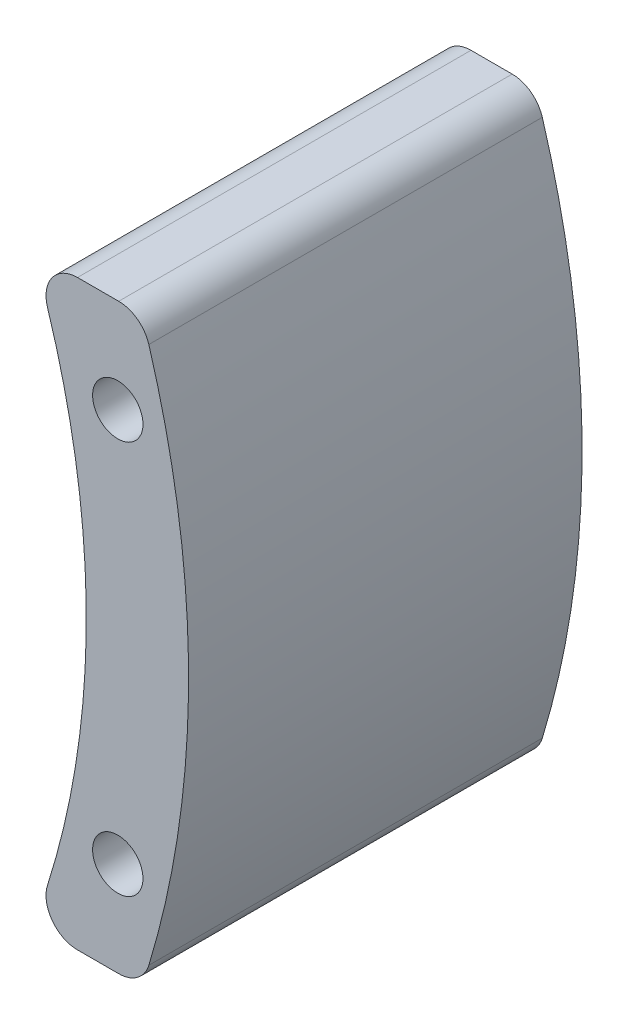
ISO-10303-21;
HEADER;
FILE_DESCRIPTION(('STEP AP214'),'2;1');
FILE_NAME('part.step','',(''),(''),'','','');
FILE_SCHEMA(('AUTOMOTIVE_DESIGN { 1 0 10303 214 1 1 1 1 }'));
ENDSEC;
DATA;
#1=APPLICATION_CONTEXT('core data for automotive mechanical design processes');
#2=APPLICATION_PROTOCOL_DEFINITION('international standard','automotive_design',2000,#1);
#3=PRODUCT_CONTEXT('',#1,'mechanical');
#4=PRODUCT('Part','Part','',(#3));
#5=PRODUCT_RELATED_PRODUCT_CATEGORY('part','',(#4));
#6=PRODUCT_DEFINITION_FORMATION('','',#4);
#7=PRODUCT_DEFINITION_CONTEXT('part definition',#1,'design');
#8=PRODUCT_DEFINITION('design','',#6,#7);
#9=PRODUCT_DEFINITION_SHAPE('','',#8);
#10=(LENGTH_UNIT() NAMED_UNIT(*) SI_UNIT(.MILLI.,.METRE.));
#11=(NAMED_UNIT(*) PLANE_ANGLE_UNIT() SI_UNIT($,.RADIAN.));
#12=(NAMED_UNIT(*) SI_UNIT($,.STERADIAN.) SOLID_ANGLE_UNIT());
#13=UNCERTAINTY_MEASURE_WITH_UNIT(LENGTH_MEASURE(1.E-05),#10,'distance_accuracy_value','');
#14=(GEOMETRIC_REPRESENTATION_CONTEXT(3) GLOBAL_UNCERTAINTY_ASSIGNED_CONTEXT((#13)) GLOBAL_UNIT_ASSIGNED_CONTEXT((#10,
#11,#12)) REPRESENTATION_CONTEXT('',''));
#15=CARTESIAN_POINT('',(0.,0.,0.));
#16=DIRECTION('',(0.,0.,1.));
#17=DIRECTION('',(1.,0.,0.));
#18=AXIS2_PLACEMENT_3D('',#15,#16,#17);
#19=CARTESIAN_POINT('',(51.9422756528822,-16.5,25.));
#20=DIRECTION('',(0.,0.,1.));
#21=DIRECTION('',(1.,0.,0.));
#22=AXIS2_PLACEMENT_3D('',#19,#20,#21);
#23=PLANE('',#22);
#24=CARTESIAN_POINT('',(54.5,-12.5,25.));
#25=DIRECTION('',(0.,0.,1.));
#26=DIRECTION('',(1.,0.,0.));
#27=AXIS2_PLACEMENT_3D('',#24,#25,#26);
#28=CIRCLE('',#27,1.6);
#29=CARTESIAN_POINT('',(56.1,-12.5,25.));
#30=VERTEX_POINT('',#29);
#31=EDGE_CURVE('E140',#30,#30,#28,.T.);
#32=ORIENTED_EDGE('',*,*,#31,.F.);
#33=EDGE_LOOP('',(#32));
#34=FACE_BOUND('',#33,.T.);
#35=CARTESIAN_POINT('',(51.9422756528822,-16.5,25.));
#36=DIRECTION('',(0.,0.,1.));
#37=DIRECTION('',(1.,0.,0.));
#38=AXIS2_PLACEMENT_3D('',#35,#36,#37);
#39=CIRCLE('',#38,2.);
#40=CARTESIAN_POINT('',(50.0361370968131,-15.8944954128441,25.));
#41=VERTEX_POINT('',#40);
#42=CARTESIAN_POINT('',(51.9422756528822,-18.5,25.));
#43=VERTEX_POINT('',#42);
#44=EDGE_CURVE('E151',#41,#43,#39,.T.);
#45=ORIENTED_EDGE('',*,*,#44,.T.);
#46=DIRECTION('',(1.,0.,0.));
#47=VECTOR('',#46,1.);
#48=CARTESIAN_POINT('',(51.9422756528822,-18.5,25.));
#49=LINE('',#48,#47);
#50=CARTESIAN_POINT('',(54.5596004384196,-18.5,25.));
#51=VERTEX_POINT('',#50);
#52=EDGE_CURVE('E99',#43,#51,#49,.T.);
#53=ORIENTED_EDGE('',*,*,#52,.T.);
#54=CARTESIAN_POINT('',(54.5596004384196,-16.5,25.));
#55=DIRECTION('',(0.,0.,1.));
#56=DIRECTION('',(-1.,0.,0.));
#57=AXIS2_PLACEMENT_3D('',#54,#55,#56);
#58=CIRCLE('',#57,2.00000000000001);
#59=CARTESIAN_POINT('',(56.4739723836274,-17.0789473684211,25.));
#60=VERTEX_POINT('',#59);
#61=EDGE_CURVE('E166',#51,#60,#58,.T.);
#62=ORIENTED_EDGE('',*,*,#61,.T.);
#63=CARTESIAN_POINT('',(0.,0.,25.));
#64=DIRECTION('',(0.,0.,1.));
#65=DIRECTION('',(1.,0.,0.));
#66=AXIS2_PLACEMENT_3D('',#63,#64,#65);
#67=CIRCLE('',#66,59.);
#68=CARTESIAN_POINT('',(56.4739723836273,17.0789473684211,25.));
#69=VERTEX_POINT('',#68);
#70=EDGE_CURVE('E179',#60,#69,#67,.T.);
#71=ORIENTED_EDGE('',*,*,#70,.T.);
#72=CARTESIAN_POINT('',(54.5596004384196,16.5,25.));
#73=DIRECTION('',(0.,0.,1.));
#74=DIRECTION('',(1.,0.,0.));
#75=AXIS2_PLACEMENT_3D('',#72,#73,#74);
#76=CIRCLE('',#75,2.00000000000001);
#77=CARTESIAN_POINT('',(54.5596004384196,18.5,25.));
#78=VERTEX_POINT('',#77);
#79=EDGE_CURVE('E118',#69,#78,#76,.T.);
#80=ORIENTED_EDGE('',*,*,#79,.T.);
#81=DIRECTION('',(-1.,0.,0.));
#82=VECTOR('',#81,1.);
#83=CARTESIAN_POINT('',(54.5596004384196,18.5,25.));
#84=LINE('',#83,#82);
#85=CARTESIAN_POINT('',(51.9422756528822,18.5,25.));
#86=VERTEX_POINT('',#85);
#87=EDGE_CURVE('E112',#78,#86,#84,.T.);
#88=ORIENTED_EDGE('',*,*,#87,.T.);
#89=CARTESIAN_POINT('',(51.9422756528822,16.5,25.));
#90=DIRECTION('',(0.,0.,1.));
#91=DIRECTION('',(-1.,0.,0.));
#92=AXIS2_PLACEMENT_3D('',#89,#90,#91);
#93=CIRCLE('',#92,2.);
#94=CARTESIAN_POINT('',(50.0361370968131,15.8944954128441,25.));
#95=VERTEX_POINT('',#94);
#96=EDGE_CURVE('E116',#86,#95,#93,.T.);
#97=ORIENTED_EDGE('',*,*,#96,.T.);
#98=CARTESIAN_POINT('',(0.,0.,25.));
#99=DIRECTION('',(0.,0.,-1.));
#100=DIRECTION('',(1.,0.,0.));
#101=AXIS2_PLACEMENT_3D('',#98,#99,#100);
#102=CIRCLE('',#101,52.5);
#103=EDGE_CURVE('E56',#95,#41,#102,.T.);
#104=ORIENTED_EDGE('',*,*,#103,.T.);
#105=EDGE_LOOP('',(#45,#53,#62,#71,#80,#88,#97,#104));
#106=FACE_BOUND('',#105,.T.);
#107=CARTESIAN_POINT('',(54.5,12.5,25.));
#108=DIRECTION('',(0.,0.,1.));
#109=DIRECTION('',(1.,0.,0.));
#110=AXIS2_PLACEMENT_3D('',#107,#108,#109);
#111=CIRCLE('',#110,1.6);
#112=CARTESIAN_POINT('',(56.1,12.5,25.));
#113=VERTEX_POINT('',#112);
#114=EDGE_CURVE('E188',#113,#113,#111,.T.);
#115=ORIENTED_EDGE('',*,*,#114,.F.);
#116=EDGE_LOOP('',(#115));
#117=FACE_BOUND('',#116,.T.);
#118=ADVANCED_FACE('F39',(#34,#106,#117),#23,.T.);
#119=CARTESIAN_POINT('',(51.9422756528822,-16.5,0.));
#120=DIRECTION('',(0.,0.,1.));
#121=DIRECTION('',(1.,0.,0.));
#122=AXIS2_PLACEMENT_3D('',#119,#120,#121);
#123=PLANE('',#122);
#124=CARTESIAN_POINT('',(51.9422756528822,-16.5,0.));
#125=DIRECTION('',(0.,0.,1.));
#126=DIRECTION('',(1.,0.,0.));
#127=AXIS2_PLACEMENT_3D('',#124,#125,#126);
#128=CIRCLE('',#127,2.);
#129=CARTESIAN_POINT('',(50.0361370968131,-15.8944954128441,0.));
#130=VERTEX_POINT('',#129);
#131=CARTESIAN_POINT('',(51.9422756528822,-18.5,0.));
#132=VERTEX_POINT('',#131);
#133=EDGE_CURVE('E136',#130,#132,#128,.T.);
#134=ORIENTED_EDGE('',*,*,#133,.F.);
#135=CARTESIAN_POINT('',(0.,0.,0.));
#136=DIRECTION('',(0.,0.,-1.));
#137=DIRECTION('',(1.,0.,0.));
#138=AXIS2_PLACEMENT_3D('',#135,#136,#137);
#139=CIRCLE('',#138,52.5);
#140=CARTESIAN_POINT('',(50.0361370968131,15.8944954128441,0.));
#141=VERTEX_POINT('',#140);
#142=EDGE_CURVE('E91',#141,#130,#139,.T.);
#143=ORIENTED_EDGE('',*,*,#142,.F.);
#144=CARTESIAN_POINT('',(51.9422756528822,16.5,0.));
#145=DIRECTION('',(0.,0.,1.));
#146=DIRECTION('',(-1.,0.,0.));
#147=AXIS2_PLACEMENT_3D('',#144,#145,#146);
#148=CIRCLE('',#147,2.);
#149=CARTESIAN_POINT('',(51.9422756528822,18.5,0.));
#150=VERTEX_POINT('',#149);
#151=EDGE_CURVE('E85',#150,#141,#148,.T.);
#152=ORIENTED_EDGE('',*,*,#151,.F.);
#153=DIRECTION('',(-1.,0.,0.));
#154=VECTOR('',#153,1.);
#155=CARTESIAN_POINT('',(54.5596004384196,18.5,0.));
#156=LINE('',#155,#154);
#157=CARTESIAN_POINT('',(54.5596004384196,18.5,0.));
#158=VERTEX_POINT('',#157);
#159=EDGE_CURVE('E126',#158,#150,#156,.T.);
#160=ORIENTED_EDGE('',*,*,#159,.F.);
#161=CARTESIAN_POINT('',(54.5596004384196,16.5,0.));
#162=DIRECTION('',(0.,0.,1.));
#163=DIRECTION('',(1.,0.,0.));
#164=AXIS2_PLACEMENT_3D('',#161,#162,#163);
#165=CIRCLE('',#164,2.00000000000001);
#166=CARTESIAN_POINT('',(56.4739723836273,17.0789473684211,0.));
#167=VERTEX_POINT('',#166);
#168=EDGE_CURVE('E146',#167,#158,#165,.T.);
#169=ORIENTED_EDGE('',*,*,#168,.F.);
#170=CARTESIAN_POINT('',(0.,0.,0.));
#171=DIRECTION('',(0.,0.,1.));
#172=DIRECTION('',(1.,0.,0.));
#173=AXIS2_PLACEMENT_3D('',#170,#171,#172);
#174=CIRCLE('',#173,59.);
#175=CARTESIAN_POINT('',(56.4739723836274,-17.0789473684211,0.));
#176=VERTEX_POINT('',#175);
#177=EDGE_CURVE('E144',#176,#167,#174,.T.);
#178=ORIENTED_EDGE('',*,*,#177,.F.);
#179=CARTESIAN_POINT('',(54.5596004384196,-16.5,0.));
#180=DIRECTION('',(0.,0.,1.));
#181=DIRECTION('',(-1.,0.,0.));
#182=AXIS2_PLACEMENT_3D('',#179,#180,#181);
#183=CIRCLE('',#182,2.00000000000001);
#184=CARTESIAN_POINT('',(54.5596004384196,-18.5,0.));
#185=VERTEX_POINT('',#184);
#186=EDGE_CURVE('E142',#185,#176,#183,.T.);
#187=ORIENTED_EDGE('',*,*,#186,.F.);
#188=DIRECTION('',(1.,0.,0.));
#189=VECTOR('',#188,1.);
#190=CARTESIAN_POINT('',(51.9422756528822,-18.5,0.));
#191=LINE('',#190,#189);
#192=EDGE_CURVE('E139',#132,#185,#191,.T.);
#193=ORIENTED_EDGE('',*,*,#192,.F.);
#194=EDGE_LOOP('',(#134,#143,#152,#160,#169,#178,#187,#193));
#195=FACE_BOUND('',#194,.T.);
#196=CARTESIAN_POINT('',(54.5,-12.5,0.));
#197=DIRECTION('',(0.,0.,1.));
#198=DIRECTION('',(1.,0.,0.));
#199=AXIS2_PLACEMENT_3D('',#196,#197,#198);
#200=CIRCLE('',#199,1.6);
#201=CARTESIAN_POINT('',(56.1,-12.5,0.));
#202=VERTEX_POINT('',#201);
#203=EDGE_CURVE('E185',#202,#202,#200,.T.);
#204=ORIENTED_EDGE('',*,*,#203,.T.);
#205=EDGE_LOOP('',(#204));
#206=FACE_BOUND('',#205,.T.);
#207=CARTESIAN_POINT('',(54.5,12.5,0.));
#208=DIRECTION('',(0.,0.,1.));
#209=DIRECTION('',(1.,0.,0.));
#210=AXIS2_PLACEMENT_3D('',#207,#208,#209);
#211=CIRCLE('',#210,1.6);
#212=CARTESIAN_POINT('',(56.1,12.5,0.));
#213=VERTEX_POINT('',#212);
#214=EDGE_CURVE('E191',#213,#213,#211,.T.);
#215=ORIENTED_EDGE('',*,*,#214,.T.);
#216=EDGE_LOOP('',(#215));
#217=FACE_BOUND('',#216,.T.);
#218=ADVANCED_FACE('F170',(#195,#206,#217),#123,.F.);
#219=CARTESIAN_POINT('',(51.9422756528822,-16.5,25.));
#220=DIRECTION('',(0.,0.,-1.));
#221=DIRECTION('',(-1.,0.,0.));
#222=AXIS2_PLACEMENT_3D('',#219,#220,#221);
#223=CYLINDRICAL_SURFACE('',#222,2.);
#224=ORIENTED_EDGE('',*,*,#133,.T.);
#225=DIRECTION('',(0.,0.,-1.));
#226=VECTOR('',#225,1.);
#227=CARTESIAN_POINT('',(51.9422756528822,-18.5,25.));
#228=LINE('',#227,#226);
#229=EDGE_CURVE('E11',#43,#132,#228,.T.);
#230=ORIENTED_EDGE('',*,*,#229,.F.);
#231=ORIENTED_EDGE('',*,*,#44,.F.);
#232=DIRECTION('',(0.,0.,-1.));
#233=VECTOR('',#232,1.);
#234=CARTESIAN_POINT('',(50.0361370968131,-15.8944954128441,25.));
#235=LINE('',#234,#233);
#236=EDGE_CURVE('E132',#41,#130,#235,.T.);
#237=ORIENTED_EDGE('',*,*,#236,.T.);
#238=EDGE_LOOP('',(#224,#230,#231,#237));
#239=FACE_BOUND('',#238,.T.);
#240=ADVANCED_FACE('F41',(#239),#223,.T.);
#241=CARTESIAN_POINT('',(51.9422756528822,-18.5,25.));
#242=DIRECTION('',(0.,1.,0.));
#243=DIRECTION('',(0.,0.,1.));
#244=AXIS2_PLACEMENT_3D('',#241,#242,#243);
#245=PLANE('',#244);
#246=ORIENTED_EDGE('',*,*,#192,.T.);
#247=DIRECTION('',(0.,0.,-1.));
#248=VECTOR('',#247,1.);
#249=CARTESIAN_POINT('',(54.5596004384196,-18.5,25.));
#250=LINE('',#249,#248);
#251=EDGE_CURVE('E48',#51,#185,#250,.T.);
#252=ORIENTED_EDGE('',*,*,#251,.F.);
#253=ORIENTED_EDGE('',*,*,#52,.F.);
#254=ORIENTED_EDGE('',*,*,#229,.T.);
#255=EDGE_LOOP('',(#246,#252,#253,#254));
#256=FACE_BOUND('',#255,.T.);
#257=ADVANCED_FACE('F223',(#256),#245,.F.);
#258=CARTESIAN_POINT('',(54.5596004384196,-16.5,25.));
#259=DIRECTION('',(0.,0.,-1.));
#260=DIRECTION('',(-1.,0.,0.));
#261=AXIS2_PLACEMENT_3D('',#258,#259,#260);
#262=CYLINDRICAL_SURFACE('',#261,2.00000000000001);
#263=ORIENTED_EDGE('',*,*,#186,.T.);
#264=DIRECTION('',(0.,0.,-1.));
#265=VECTOR('',#264,1.);
#266=CARTESIAN_POINT('',(56.4739723836274,-17.0789473684211,25.));
#267=LINE('',#266,#265);
#268=EDGE_CURVE('E158',#60,#176,#267,.T.);
#269=ORIENTED_EDGE('',*,*,#268,.F.);
#270=ORIENTED_EDGE('',*,*,#61,.F.);
#271=ORIENTED_EDGE('',*,*,#251,.T.);
#272=EDGE_LOOP('',(#263,#269,#270,#271));
#273=FACE_BOUND('',#272,.T.);
#274=ADVANCED_FACE('F164',(#273),#262,.T.);
#275=CARTESIAN_POINT('',(0.,0.,25.));
#276=DIRECTION('',(0.,0.,-1.));
#277=DIRECTION('',(-1.,0.,0.));
#278=AXIS2_PLACEMENT_3D('',#275,#276,#277);
#279=CYLINDRICAL_SURFACE('',#278,59.);
#280=ORIENTED_EDGE('',*,*,#177,.T.);
#281=DIRECTION('',(0.,0.,-1.));
#282=VECTOR('',#281,1.);
#283=CARTESIAN_POINT('',(56.4739723836273,17.0789473684211,25.));
#284=LINE('',#283,#282);
#285=EDGE_CURVE('E155',#69,#167,#284,.T.);
#286=ORIENTED_EDGE('',*,*,#285,.F.);
#287=ORIENTED_EDGE('',*,*,#70,.F.);
#288=ORIENTED_EDGE('',*,*,#268,.T.);
#289=EDGE_LOOP('',(#280,#286,#287,#288));
#290=FACE_BOUND('',#289,.T.);
#291=ADVANCED_FACE('F175',(#290),#279,.T.);
#292=CARTESIAN_POINT('',(54.5596004384196,16.5,25.));
#293=DIRECTION('',(0.,0.,-1.));
#294=DIRECTION('',(-1.,0.,0.));
#295=AXIS2_PLACEMENT_3D('',#292,#293,#294);
#296=CYLINDRICAL_SURFACE('',#295,2.00000000000001);
#297=ORIENTED_EDGE('',*,*,#168,.T.);
#298=DIRECTION('',(0.,0.,-1.));
#299=VECTOR('',#298,1.);
#300=CARTESIAN_POINT('',(54.5596004384196,18.5,25.));
#301=LINE('',#300,#299);
#302=EDGE_CURVE('E127',#78,#158,#301,.T.);
#303=ORIENTED_EDGE('',*,*,#302,.F.);
#304=ORIENTED_EDGE('',*,*,#79,.F.);
#305=ORIENTED_EDGE('',*,*,#285,.T.);
#306=EDGE_LOOP('',(#297,#303,#304,#305));
#307=FACE_BOUND('',#306,.T.);
#308=ADVANCED_FACE('F178',(#307),#296,.T.);
#309=CARTESIAN_POINT('',(54.5596004384196,18.5,25.));
#310=DIRECTION('',(0.,-1.,0.));
#311=DIRECTION('',(0.,0.,-1.));
#312=AXIS2_PLACEMENT_3D('',#309,#310,#311);
#313=PLANE('',#312);
#314=ORIENTED_EDGE('',*,*,#159,.T.);
#315=DIRECTION('',(0.,0.,-1.));
#316=VECTOR('',#315,1.);
#317=CARTESIAN_POINT('',(51.9422756528822,18.5,25.));
#318=LINE('',#317,#316);
#319=EDGE_CURVE('E123',#86,#150,#318,.T.);
#320=ORIENTED_EDGE('',*,*,#319,.F.);
#321=ORIENTED_EDGE('',*,*,#87,.F.);
#322=ORIENTED_EDGE('',*,*,#302,.T.);
#323=EDGE_LOOP('',(#314,#320,#321,#322));
#324=FACE_BOUND('',#323,.T.);
#325=ADVANCED_FACE('F124',(#324),#313,.F.);
#326=CARTESIAN_POINT('',(51.9422756528822,16.5,25.));
#327=DIRECTION('',(0.,0.,-1.));
#328=DIRECTION('',(-1.,0.,0.));
#329=AXIS2_PLACEMENT_3D('',#326,#327,#328);
#330=CYLINDRICAL_SURFACE('',#329,2.);
#331=ORIENTED_EDGE('',*,*,#151,.T.);
#332=DIRECTION('',(0.,0.,-1.));
#333=VECTOR('',#332,1.);
#334=CARTESIAN_POINT('',(50.0361370968131,15.8944954128441,25.));
#335=LINE('',#334,#333);
#336=EDGE_CURVE('E128',#95,#141,#335,.T.);
#337=ORIENTED_EDGE('',*,*,#336,.F.);
#338=ORIENTED_EDGE('',*,*,#96,.F.);
#339=ORIENTED_EDGE('',*,*,#319,.T.);
#340=EDGE_LOOP('',(#331,#337,#338,#339));
#341=FACE_BOUND('',#340,.T.);
#342=ADVANCED_FACE('F130',(#341),#330,.T.);
#343=CARTESIAN_POINT('',(0.,0.,25.));
#344=DIRECTION('',(0.,0.,-1.));
#345=DIRECTION('',(-1.,0.,0.));
#346=AXIS2_PLACEMENT_3D('',#343,#344,#345);
#347=CYLINDRICAL_SURFACE('',#346,52.5);
#348=ORIENTED_EDGE('',*,*,#142,.T.);
#349=ORIENTED_EDGE('',*,*,#236,.F.);
#350=ORIENTED_EDGE('',*,*,#103,.F.);
#351=ORIENTED_EDGE('',*,*,#336,.T.);
#352=EDGE_LOOP('',(#348,#349,#350,#351));
#353=FACE_BOUND('',#352,.T.);
#354=ADVANCED_FACE('F211',(#353),#347,.F.);
#355=CARTESIAN_POINT('',(54.5,-12.5,25.));
#356=DIRECTION('',(0.,0.,-1.));
#357=DIRECTION('',(-1.,0.,0.));
#358=AXIS2_PLACEMENT_3D('',#355,#356,#357);
#359=CYLINDRICAL_SURFACE('',#358,1.6);
#360=ORIENTED_EDGE('',*,*,#31,.T.);
#361=EDGE_LOOP('',(#360));
#362=FACE_BOUND('',#361,.T.);
#363=ORIENTED_EDGE('',*,*,#203,.F.);
#364=EDGE_LOOP('',(#363));
#365=FACE_BOUND('',#364,.T.);
#366=ADVANCED_FACE('F208',(#362,#365),#359,.F.);
#367=CARTESIAN_POINT('',(54.5,12.5,25.));
#368=DIRECTION('',(0.,0.,-1.));
#369=DIRECTION('',(-1.,0.,0.));
#370=AXIS2_PLACEMENT_3D('',#367,#368,#369);
#371=CYLINDRICAL_SURFACE('',#370,1.6);
#372=ORIENTED_EDGE('',*,*,#114,.T.);
#373=EDGE_LOOP('',(#372));
#374=FACE_BOUND('',#373,.T.);
#375=ORIENTED_EDGE('',*,*,#214,.F.);
#376=EDGE_LOOP('',(#375));
#377=FACE_BOUND('',#376,.T.);
#378=ADVANCED_FACE('F197',(#374,#377),#371,.F.);
#379=CLOSED_SHELL('',(#118,#218,#240,#257,#274,#291,#308,#325,#342,#354,#366,#378));
#380=MANIFOLD_SOLID_BREP('B2',#379);
#381=ADVANCED_BREP_SHAPE_REPRESENTATION('',(#18,#380),#14);
#382=SHAPE_DEFINITION_REPRESENTATION(#9,#381);
ENDSEC;
END-ISO-10303-21;
